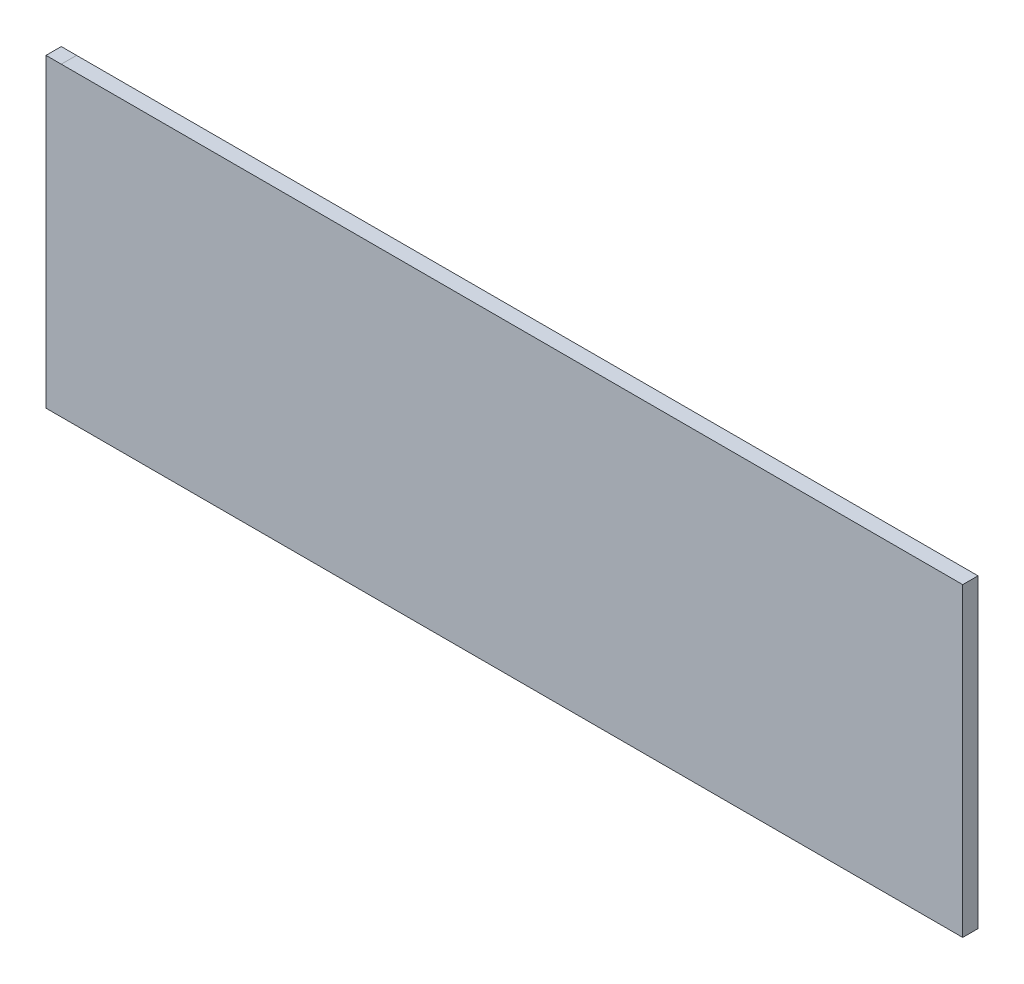
ISO-10303-21;
HEADER;
FILE_DESCRIPTION(('STEP AP214'),'2;1');
FILE_NAME('part.step','',(''),(''),'','','');
FILE_SCHEMA(('AUTOMOTIVE_DESIGN { 1 0 10303 214 1 1 1 1 }'));
ENDSEC;
DATA;
#1=APPLICATION_CONTEXT('core data for automotive mechanical design processes');
#2=APPLICATION_PROTOCOL_DEFINITION('international standard','automotive_design',2000,#1);
#3=PRODUCT_CONTEXT('',#1,'mechanical');
#4=PRODUCT('Part','Part','',(#3));
#5=PRODUCT_RELATED_PRODUCT_CATEGORY('part','',(#4));
#6=PRODUCT_DEFINITION_FORMATION('','',#4);
#7=PRODUCT_DEFINITION_CONTEXT('part definition',#1,'design');
#8=PRODUCT_DEFINITION('design','',#6,#7);
#9=PRODUCT_DEFINITION_SHAPE('','',#8);
#10=(LENGTH_UNIT() NAMED_UNIT(*) SI_UNIT(.MILLI.,.METRE.));
#11=(NAMED_UNIT(*) PLANE_ANGLE_UNIT() SI_UNIT($,.RADIAN.));
#12=(NAMED_UNIT(*) SI_UNIT($,.STERADIAN.) SOLID_ANGLE_UNIT());
#13=UNCERTAINTY_MEASURE_WITH_UNIT(LENGTH_MEASURE(1.E-05),#10,'distance_accuracy_value','');
#14=(GEOMETRIC_REPRESENTATION_CONTEXT(3) GLOBAL_UNCERTAINTY_ASSIGNED_CONTEXT((#13)) GLOBAL_UNIT_ASSIGNED_CONTEXT((#10,
#11,#12)) REPRESENTATION_CONTEXT('',''));
#15=CARTESIAN_POINT('',(0.,0.,0.));
#16=DIRECTION('',(0.,0.,1.));
#17=DIRECTION('',(1.,0.,0.));
#18=AXIS2_PLACEMENT_3D('',#15,#16,#17);
#19=CARTESIAN_POINT('',(0.,0.,20.));
#20=DIRECTION('',(0.,1.,0.));
#21=DIRECTION('',(0.,0.,1.));
#22=AXIS2_PLACEMENT_3D('',#19,#20,#21);
#23=PLANE('',#22);
#24=DIRECTION('',(0.,0.,-1.));
#25=VECTOR('',#24,1.);
#26=CARTESIAN_POINT('',(1180.,0.,20.));
#27=LINE('',#26,#25);
#28=CARTESIAN_POINT('',(1180.,0.,20.));
#29=VERTEX_POINT('',#28);
#30=CARTESIAN_POINT('',(1180.,0.,0.));
#31=VERTEX_POINT('',#30);
#32=EDGE_CURVE('E11',#29,#31,#27,.T.);
#33=ORIENTED_EDGE('',*,*,#32,.F.);
#34=DIRECTION('',(1.,0.,0.));
#35=VECTOR('',#34,1.);
#36=CARTESIAN_POINT('',(0.,0.,20.));
#37=LINE('',#36,#35);
#38=CARTESIAN_POINT('',(0.,0.,20.));
#39=VERTEX_POINT('',#38);
#40=EDGE_CURVE('E102',#39,#29,#37,.T.);
#41=ORIENTED_EDGE('',*,*,#40,.F.);
#42=DIRECTION('',(0.,0.,-1.));
#43=VECTOR('',#42,1.);
#44=CARTESIAN_POINT('',(0.,0.,20.));
#45=LINE('',#44,#43);
#46=CARTESIAN_POINT('',(0.,0.,0.));
#47=VERTEX_POINT('',#46);
#48=EDGE_CURVE('E105',#39,#47,#45,.T.);
#49=ORIENTED_EDGE('',*,*,#48,.T.);
#50=DIRECTION('',(1.,0.,0.));
#51=VECTOR('',#50,1.);
#52=CARTESIAN_POINT('',(0.,0.,0.));
#53=LINE('',#52,#51);
#54=EDGE_CURVE('E149',#47,#31,#53,.T.);
#55=ORIENTED_EDGE('',*,*,#54,.T.);
#56=EDGE_LOOP('',(#33,#41,#49,#55));
#57=FACE_BOUND('',#56,.T.);
#58=ADVANCED_FACE('F53',(#57),#23,.F.);
#59=CARTESIAN_POINT('',(0.,400.,20.));
#60=DIRECTION('',(0.,-1.,0.));
#61=DIRECTION('',(0.,0.,-1.));
#62=AXIS2_PLACEMENT_3D('',#59,#60,#61);
#63=PLANE('',#62);
#64=DIRECTION('',(0.,0.,1.));
#65=VECTOR('',#64,1.);
#66=CARTESIAN_POINT('',(20.,400.,20.));
#67=LINE('',#66,#65);
#68=CARTESIAN_POINT('',(20.,400.,0.));
#69=VERTEX_POINT('',#68);
#70=CARTESIAN_POINT('',(20.,400.,20.));
#71=VERTEX_POINT('',#70);
#72=EDGE_CURVE('E62',#69,#71,#67,.T.);
#73=ORIENTED_EDGE('',*,*,#72,.F.);
#74=DIRECTION('',(-1.,0.,0.));
#75=VECTOR('',#74,1.);
#76=CARTESIAN_POINT('',(0.,400.,0.));
#77=LINE('',#76,#75);
#78=CARTESIAN_POINT('',(0.,400.,0.));
#79=VERTEX_POINT('',#78);
#80=EDGE_CURVE('E145',#69,#79,#77,.T.);
#81=ORIENTED_EDGE('',*,*,#80,.T.);
#82=DIRECTION('',(0.,0.,-1.));
#83=VECTOR('',#82,1.);
#84=CARTESIAN_POINT('',(0.,400.,20.));
#85=LINE('',#84,#83);
#86=CARTESIAN_POINT('',(0.,400.,20.));
#87=VERTEX_POINT('',#86);
#88=EDGE_CURVE('E138',#87,#79,#85,.T.);
#89=ORIENTED_EDGE('',*,*,#88,.F.);
#90=DIRECTION('',(-1.,0.,0.));
#91=VECTOR('',#90,1.);
#92=CARTESIAN_POINT('',(0.,400.,20.));
#93=LINE('',#92,#91);
#94=EDGE_CURVE('E117',#71,#87,#93,.T.);
#95=ORIENTED_EDGE('',*,*,#94,.F.);
#96=EDGE_LOOP('',(#73,#81,#89,#95));
#97=FACE_BOUND('',#96,.T.);
#98=ADVANCED_FACE('F171',(#97),#63,.F.);
#99=CARTESIAN_POINT('',(0.,0.,20.));
#100=DIRECTION('',(1.,0.,0.));
#101=DIRECTION('',(0.,0.,-1.));
#102=AXIS2_PLACEMENT_3D('',#99,#100,#101);
#103=PLANE('',#102);
#104=DIRECTION('',(0.,-1.,0.));
#105=VECTOR('',#104,1.);
#106=CARTESIAN_POINT('',(0.,0.,0.));
#107=LINE('',#106,#105);
#108=EDGE_CURVE('E125',#79,#47,#107,.T.);
#109=ORIENTED_EDGE('',*,*,#108,.T.);
#110=ORIENTED_EDGE('',*,*,#48,.F.);
#111=DIRECTION('',(0.,-1.,0.));
#112=VECTOR('',#111,1.);
#113=CARTESIAN_POINT('',(0.,0.,20.));
#114=LINE('',#113,#112);
#115=EDGE_CURVE('E113',#87,#39,#114,.T.);
#116=ORIENTED_EDGE('',*,*,#115,.F.);
#117=ORIENTED_EDGE('',*,*,#88,.T.);
#118=EDGE_LOOP('',(#109,#110,#116,#117));
#119=FACE_BOUND('',#118,.T.);
#120=ADVANCED_FACE('F55',(#119),#103,.F.);
#121=CARTESIAN_POINT('',(1200.,0.,20.));
#122=VERTEX_POINT('',#121);
#123=EDGE_CURVE('E110',#29,#122,#37,.T.);
#124=ORIENTED_EDGE('',*,*,#123,.F.);
#125=ORIENTED_EDGE('',*,*,#32,.T.);
#126=CARTESIAN_POINT('',(1200.,0.,0.));
#127=VERTEX_POINT('',#126);
#128=EDGE_CURVE('E152',#31,#127,#53,.T.);
#129=ORIENTED_EDGE('',*,*,#128,.T.);
#130=DIRECTION('',(0.,0.,-1.));
#131=VECTOR('',#130,1.);
#132=CARTESIAN_POINT('',(1200.,0.,20.));
#133=LINE('',#132,#131);
#134=EDGE_CURVE('E127',#122,#127,#133,.T.);
#135=ORIENTED_EDGE('',*,*,#134,.F.);
#136=EDGE_LOOP('',(#124,#125,#129,#135));
#137=FACE_BOUND('',#136,.T.);
#138=ADVANCED_FACE('F177',(#137),#23,.F.);
#139=CARTESIAN_POINT('',(1200.,0.,20.));
#140=DIRECTION('',(-1.,0.,0.));
#141=DIRECTION('',(0.,0.,1.));
#142=AXIS2_PLACEMENT_3D('',#139,#140,#141);
#143=PLANE('',#142);
#144=DIRECTION('',(0.,1.,0.));
#145=VECTOR('',#144,1.);
#146=CARTESIAN_POINT('',(1200.,0.,0.));
#147=LINE('',#146,#145);
#148=CARTESIAN_POINT('',(1200.,400.,0.));
#149=VERTEX_POINT('',#148);
#150=EDGE_CURVE('E146',#127,#149,#147,.T.);
#151=ORIENTED_EDGE('',*,*,#150,.T.);
#152=DIRECTION('',(0.,0.,-1.));
#153=VECTOR('',#152,1.);
#154=CARTESIAN_POINT('',(1200.,400.,20.));
#155=LINE('',#154,#153);
#156=CARTESIAN_POINT('',(1200.,400.,20.));
#157=VERTEX_POINT('',#156);
#158=EDGE_CURVE('E132',#157,#149,#155,.T.);
#159=ORIENTED_EDGE('',*,*,#158,.F.);
#160=DIRECTION('',(0.,1.,0.));
#161=VECTOR('',#160,1.);
#162=CARTESIAN_POINT('',(1200.,0.,20.));
#163=LINE('',#162,#161);
#164=EDGE_CURVE('E109',#122,#157,#163,.T.);
#165=ORIENTED_EDGE('',*,*,#164,.F.);
#166=ORIENTED_EDGE('',*,*,#134,.T.);
#167=EDGE_LOOP('',(#151,#159,#165,#166));
#168=FACE_BOUND('',#167,.T.);
#169=ADVANCED_FACE('F164',(#168),#143,.F.);
#170=EDGE_CURVE('E122',#149,#69,#77,.T.);
#171=ORIENTED_EDGE('',*,*,#170,.T.);
#172=ORIENTED_EDGE('',*,*,#72,.T.);
#173=EDGE_CURVE('E141',#157,#71,#93,.T.);
#174=ORIENTED_EDGE('',*,*,#173,.F.);
#175=ORIENTED_EDGE('',*,*,#158,.T.);
#176=EDGE_LOOP('',(#171,#172,#174,#175));
#177=FACE_BOUND('',#176,.T.);
#178=ADVANCED_FACE('F168',(#177),#63,.F.);
#179=CARTESIAN_POINT('',(0.,400.,20.));
#180=DIRECTION('',(0.,0.,-1.));
#181=DIRECTION('',(-1.,0.,0.));
#182=AXIS2_PLACEMENT_3D('',#179,#180,#181);
#183=PLANE('',#182);
#184=ORIENTED_EDGE('',*,*,#115,.T.);
#185=ORIENTED_EDGE('',*,*,#40,.T.);
#186=ORIENTED_EDGE('',*,*,#123,.T.);
#187=ORIENTED_EDGE('',*,*,#164,.T.);
#188=ORIENTED_EDGE('',*,*,#173,.T.);
#189=ORIENTED_EDGE('',*,*,#94,.T.);
#190=EDGE_LOOP('',(#184,#185,#186,#187,#188,#189));
#191=FACE_BOUND('',#190,.T.);
#192=ADVANCED_FACE('F114',(#191),#183,.F.);
#193=CARTESIAN_POINT('',(0.,400.,0.));
#194=DIRECTION('',(0.,0.,-1.));
#195=DIRECTION('',(-1.,0.,0.));
#196=AXIS2_PLACEMENT_3D('',#193,#194,#195);
#197=PLANE('',#196);
#198=ORIENTED_EDGE('',*,*,#108,.F.);
#199=ORIENTED_EDGE('',*,*,#80,.F.);
#200=ORIENTED_EDGE('',*,*,#170,.F.);
#201=ORIENTED_EDGE('',*,*,#150,.F.);
#202=ORIENTED_EDGE('',*,*,#128,.F.);
#203=ORIENTED_EDGE('',*,*,#54,.F.);
#204=EDGE_LOOP('',(#198,#199,#200,#201,#202,#203));
#205=FACE_BOUND('',#204,.T.);
#206=ADVANCED_FACE('F173',(#205),#197,.T.);
#207=CLOSED_SHELL('',(#58,#98,#120,#138,#169,#178,#192,#206));
#208=MANIFOLD_SOLID_BREP('B2',#207);
#209=ADVANCED_BREP_SHAPE_REPRESENTATION('',(#18,#208),#14);
#210=SHAPE_DEFINITION_REPRESENTATION(#9,#209);
ENDSEC;
END-ISO-10303-21;
